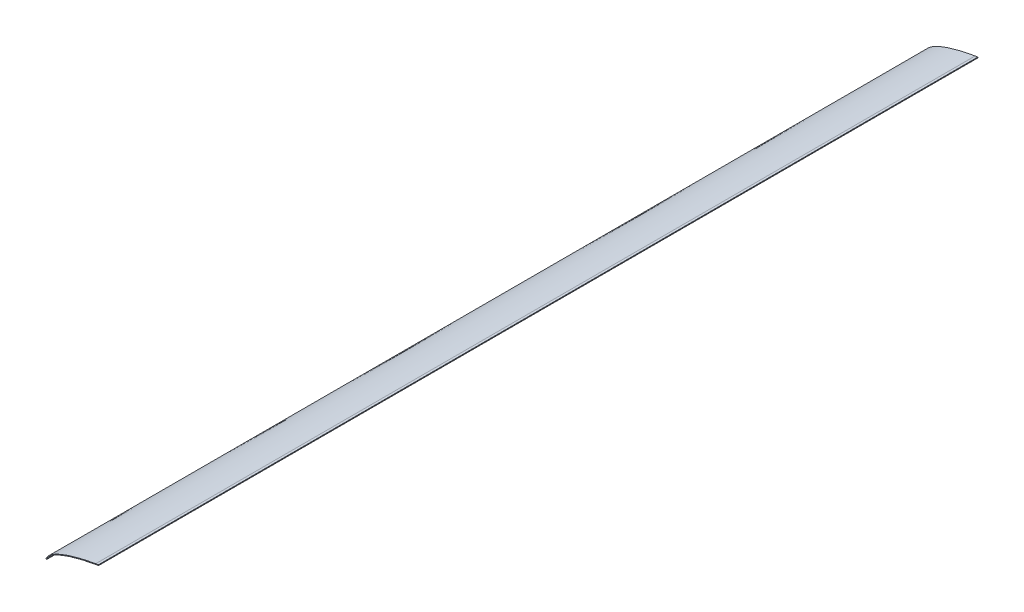
ISO-10303-21;
HEADER;
FILE_DESCRIPTION(('STEP AP214'),'2;1');
FILE_NAME('part.step','',(''),(''),'','','');
FILE_SCHEMA(('AUTOMOTIVE_DESIGN { 1 0 10303 214 1 1 1 1 }'));
ENDSEC;
DATA;
#1=APPLICATION_CONTEXT('core data for automotive mechanical design processes');
#2=APPLICATION_PROTOCOL_DEFINITION('international standard','automotive_design',2000,#1);
#3=PRODUCT_CONTEXT('',#1,'mechanical');
#4=PRODUCT('Part','Part','',(#3));
#5=PRODUCT_RELATED_PRODUCT_CATEGORY('part','',(#4));
#6=PRODUCT_DEFINITION_FORMATION('','',#4);
#7=PRODUCT_DEFINITION_CONTEXT('part definition',#1,'design');
#8=PRODUCT_DEFINITION('design','',#6,#7);
#9=PRODUCT_DEFINITION_SHAPE('','',#8);
#10=(LENGTH_UNIT() NAMED_UNIT(*) SI_UNIT(.MILLI.,.METRE.));
#11=(NAMED_UNIT(*) PLANE_ANGLE_UNIT() SI_UNIT($,.RADIAN.));
#12=(NAMED_UNIT(*) SI_UNIT($,.STERADIAN.) SOLID_ANGLE_UNIT());
#13=UNCERTAINTY_MEASURE_WITH_UNIT(LENGTH_MEASURE(1.E-05),#10,'distance_accuracy_value','');
#14=(GEOMETRIC_REPRESENTATION_CONTEXT(3) GLOBAL_UNCERTAINTY_ASSIGNED_CONTEXT((#13)) GLOBAL_UNIT_ASSIGNED_CONTEXT((#10,
#11,#12)) REPRESENTATION_CONTEXT('',''));
#15=CARTESIAN_POINT('',(0.,0.,0.));
#16=DIRECTION('',(0.,0.,1.));
#17=DIRECTION('',(1.,0.,0.));
#18=AXIS2_PLACEMENT_3D('',#15,#16,#17);
#19=CARTESIAN_POINT('',(26.1735730279579,18.1070696248927,0.));
#20=DIRECTION('',(0.,0.,1.));
#21=DIRECTION('',(1.,0.,0.));
#22=AXIS2_PLACEMENT_3D('',#19,#20,#21);
#23=PLANE('',#22);
#24=DIRECTION('',(0.986428711692198,0.164190123787241,0.));
#25=VECTOR('',#24,1.);
#26=CARTESIAN_POINT('',(60.0000000000464,25.096965283479,0.));
#27=LINE('',#26,#25);
#28=CARTESIAN_POINT('',(56.868088840388,24.5756616404486,0.));
#29=VERTEX_POINT('',#28);
#30=CARTESIAN_POINT('',(60.0000000000464,25.096965283479,0.));
#31=VERTEX_POINT('',#30);
#32=EDGE_CURVE('E92',#29,#31,#27,.T.);
#33=ORIENTED_EDGE('',*,*,#32,.T.);
#34=DIRECTION('',(0.164190123787243,-0.986428711692198,0.));
#35=VECTOR('',#34,1.);
#36=CARTESIAN_POINT('',(59.8696740892903,25.8799430733847,0.));
#37=LINE('',#36,#35);
#38=CARTESIAN_POINT('',(59.8696740892903,25.8799430733847,0.));
#39=VERTEX_POINT('',#38);
#40=EDGE_CURVE('E102',#39,#31,#37,.T.);
#41=ORIENTED_EDGE('',*,*,#40,.F.);
#42=DIRECTION('',(0.986428711692199,0.164190123787241,0.));
#43=VECTOR('',#42,1.);
#44=CARTESIAN_POINT('',(59.8696740892903,25.8799430733847,0.));
#45=LINE('',#44,#43);
#46=CARTESIAN_POINT('',(56.7377629296319,25.3586394303543,0.));
#47=VERTEX_POINT('',#46);
#48=EDGE_CURVE('E107',#47,#39,#45,.T.);
#49=ORIENTED_EDGE('',*,*,#48,.F.);
#50=CARTESIAN_POINT('',(0.266182211659313,1.84856316428566,0.));
#51=CARTESIAN_POINT('',(0.44924464314472,2.48141783019106,0.));
#52=CARTESIAN_POINT('',(0.719697200707303,3.08432936145919,0.));
#53=CARTESIAN_POINT('',(1.37239928492046,4.22504643130735,0.));
#54=CARTESIAN_POINT('',(1.75344214042597,4.76206799491569,0.));
#55=CARTESIAN_POINT('',(2.58553358979276,5.77687593522018,0.));
#56=CARTESIAN_POINT('',(3.03761658587257,6.25508580625057,0.));
#57=CARTESIAN_POINT('',(3.98470651780068,7.16260033834459,0.));
#58=CARTESIAN_POINT('',(4.47945419852874,7.5925737023852,0.));
#59=CARTESIAN_POINT('',(6.01159237537559,8.82578123051396,0.));
#60=CARTESIAN_POINT('',(7.09239267410847,9.57129417901564,0.));
#61=CARTESIAN_POINT('',(9.31483793068144,10.9599411335538,0.));
#62=CARTESIAN_POINT('',(10.4562630745476,11.6031284925342,0.));
#63=CARTESIAN_POINT('',(12.7808242306864,12.8141385533472,0.));
#64=CARTESIAN_POINT('',(13.9639436806618,13.380915492246,0.));
#65=CARTESIAN_POINT('',(16.3531244408429,14.4563366364619,0.));
#66=CARTESIAN_POINT('',(17.5604758804118,14.9654673254696,0.));
#67=CARTESIAN_POINT('',(21.2112211739816,16.4209259668176,0.));
#68=CARTESIAN_POINT('',(23.6816198400502,17.2975074083381,0.));
#69=CARTESIAN_POINT('',(28.6655262158656,18.9166318414473,0.));
#70=CARTESIAN_POINT('',(31.1788163141244,19.6589420849995,0.));
#71=CARTESIAN_POINT('',(36.2338138727653,21.0383249091718,0.));
#72=CARTESIAN_POINT('',(38.7756816859844,21.6753513203403,0.));
#73=CARTESIAN_POINT('',(43.8791516010972,22.862752341213,0.));
#74=CARTESIAN_POINT('',(46.4408972602386,23.4130209400113,0.));
#75=CARTESIAN_POINT('',(50.2944822740568,24.182908517706,0.));
#76=CARTESIAN_POINT('',(52.2240973828893,24.5538597843459,0.));
#77=CARTESIAN_POINT('',(54.1574030161472,24.9050955222655,0.));
#78=CARTESIAN_POINT('',(55.4470332570369,25.1350128545716,0.));
#79=CARTESIAN_POINT('',(56.0938750111785,25.2481256587657,0.));
#80=CARTESIAN_POINT('',(56.7377629296319,25.3586394303543,0.));
#81=B_SPLINE_CURVE_WITH_KNOTS('',3,(#50,#51,#52,#53,#54,#55,#56,#57,#58,#59,#60,#61,#62,#63,#64,
#65,#66,#67,#68,#69,#70,#71,#72,#73,#74,#75,#76,#77,#78,#79,#80),.UNSPECIFIED.,.F.,.F.,(4,2,2,2,
2,2,2,2,2,2,2,2,2,1,2,4),(0.,0.0312500000000001,0.0625000000000002,0.0937500000000002,0.125,
0.1875,0.25,0.312500000000001,0.375000000000001,0.5,0.625,0.75,0.875,0.9375,0.96875,1.),.UNSPECIFIED.);
#82=CARTESIAN_POINT('',(0.266182211659333,1.84856316428565,0.));
#83=VERTEX_POINT('',#82);
#84=EDGE_CURVE('E118',#83,#47,#81,.T.);
#85=ORIENTED_EDGE('',*,*,#84,.F.);
#86=DIRECTION('',(-0.960617945016892,0.277872567396503,0.));
#87=VECTOR('',#86,1.);
#88=CARTESIAN_POINT('',(1.02867270551649,1.62800181391468,0.));
#89=LINE('',#88,#87);
#90=CARTESIAN_POINT('',(1.02867270551649,1.62800181391468,0.));
#91=VERTEX_POINT('',#90);
#92=EDGE_CURVE('E125',#91,#83,#89,.T.);
#93=ORIENTED_EDGE('',*,*,#92,.F.);
#94=CARTESIAN_POINT('',(1.02867270551649,1.62800181391468,0.));
#95=CARTESIAN_POINT('',(1.26910284242024,2.45917959514215,0.));
#96=CARTESIAN_POINT('',(2.16801273768921,4.17333784134711,0.));
#97=CARTESIAN_POINT('',(4.24516221224329,6.4256073501974,0.));
#98=CARTESIAN_POINT('',(6.79513029223093,8.44132052099229,0.));
#99=CARTESIAN_POINT('',(10.4799443762155,10.791542168927,0.));
#100=CARTESIAN_POINT('',(15.406462343438,13.2581372528595,0.));
#101=CARTESIAN_POINT('',(21.5555350811653,15.7345861008358,0.));
#102=CARTESIAN_POINT('',(27.8492544792583,17.8591494746954,0.));
#103=CARTESIAN_POINT('',(34.2358177164054,19.7103985405859,0.));
#104=CARTESIAN_POINT('',(40.6883980359922,21.3374583404056,0.));
#105=CARTESIAN_POINT('',(48.2254204079247,23.0032324720211,0.));
#106=CARTESIAN_POINT('',(53.6330506424474,24.0204149786161,0.));
#107=CARTESIAN_POINT('',(56.868088840388,24.5756616404486,0.));
#108=B_SPLINE_CURVE_WITH_KNOTS('',3,(#94,#95,#96,#97,#98,#99,#100,#101,#102,#103,#104,#105,#106,
#107),.UNSPECIFIED.,.F.,.F.,(4,1,1,1,1,1,1,1,1,1,1,4),(0.423535425882869,0.42709852718619,
0.431188132599192,0.435277738012194,0.439367343425196,0.4475465542512,0.455725765077204,
0.463904975903208,0.472084186729212,0.480263397555217,0.488442608381221,0.500532456531814),.UNSPECIFIED.);
#109=EDGE_CURVE('E98',#91,#29,#108,.T.);
#110=ORIENTED_EDGE('',*,*,#109,.T.);
#111=EDGE_LOOP('',(#33,#41,#49,#85,#93,#110));
#112=FACE_BOUND('',#111,.T.);
#113=ADVANCED_FACE('F39',(#112),#23,.T.);
#114=CARTESIAN_POINT('',(59.8696740892903,25.8799430733847,-1064.46926122137));
#115=DIRECTION('',(-0.986428711692198,-0.164190123787243,0.));
#116=DIRECTION('',(0.164190123787243,-0.986428711692198,0.));
#117=AXIS2_PLACEMENT_3D('',#114,#115,#116);
#118=PLANE('',#117);
#119=DIRECTION('',(0.,0.,1.));
#120=VECTOR('',#119,1.);
#121=CARTESIAN_POINT('',(60.0000000000464,25.096965283479,-1064.46926122137));
#122=LINE('',#121,#120);
#123=CARTESIAN_POINT('',(60.0000000000464,25.096965283479,-1000.));
#124=VERTEX_POINT('',#123);
#125=EDGE_CURVE('E89',#124,#31,#122,.T.);
#126=ORIENTED_EDGE('',*,*,#125,.F.);
#127=DIRECTION('',(-0.164190123787243,0.986428711692198,0.));
#128=VECTOR('',#127,1.);
#129=CARTESIAN_POINT('',(59.8696740892903,25.8799430733847,-1000.));
#130=LINE('',#129,#128);
#131=CARTESIAN_POINT('',(59.8696740892903,25.8799430733847,-1000.));
#132=VERTEX_POINT('',#131);
#133=EDGE_CURVE('E43',#124,#132,#130,.T.);
#134=ORIENTED_EDGE('',*,*,#133,.T.);
#135=DIRECTION('',(0.,0.,1.));
#136=VECTOR('',#135,1.);
#137=CARTESIAN_POINT('',(59.8696740892903,25.8799430733847,-1064.46926122137));
#138=LINE('',#137,#136);
#139=EDGE_CURVE('E97',#132,#39,#138,.T.);
#140=ORIENTED_EDGE('',*,*,#139,.T.);
#141=ORIENTED_EDGE('',*,*,#40,.T.);
#142=EDGE_LOOP('',(#126,#134,#140,#141));
#143=FACE_BOUND('',#142,.T.);
#144=ADVANCED_FACE('F105',(#143),#118,.F.);
#145=CARTESIAN_POINT('',(59.8696740892903,25.8799430733847,-1064.46926122137));
#146=DIRECTION('',(0.164190123787241,-0.986428711692198,0.));
#147=DIRECTION('',(0.986428711692199,0.164190123787241,0.));
#148=AXIS2_PLACEMENT_3D('',#145,#146,#147);
#149=PLANE('',#148);
#150=ORIENTED_EDGE('',*,*,#139,.F.);
#151=DIRECTION('',(-0.986428711692199,-0.164190123787241,0.));
#152=VECTOR('',#151,1.);
#153=CARTESIAN_POINT('',(59.8696740892903,25.8799430733847,-1000.));
#154=LINE('',#153,#152);
#155=CARTESIAN_POINT('',(56.7377629296319,25.3586394303543,-1000.));
#156=VERTEX_POINT('',#155);
#157=EDGE_CURVE('E150',#132,#156,#154,.T.);
#158=ORIENTED_EDGE('',*,*,#157,.T.);
#159=DIRECTION('',(0.,0.,1.));
#160=VECTOR('',#159,1.);
#161=CARTESIAN_POINT('',(56.7377629296319,25.3586394303543,-1064.46926122137));
#162=LINE('',#161,#160);
#163=EDGE_CURVE('E145',#156,#47,#162,.T.);
#164=ORIENTED_EDGE('',*,*,#163,.T.);
#165=ORIENTED_EDGE('',*,*,#48,.T.);
#166=EDGE_LOOP('',(#150,#158,#164,#165));
#167=FACE_BOUND('',#166,.T.);
#168=ADVANCED_FACE('F147',(#167),#149,.F.);
#169=CARTESIAN_POINT('',(0.266182211659313,1.84856316428566,-1064.46926122137));
#170=CARTESIAN_POINT('',(0.44924464314472,2.48141783019106,-1064.46926122137));
#171=CARTESIAN_POINT('',(0.719697200707303,3.08432936145919,-1064.46926122137));
#172=CARTESIAN_POINT('',(1.37239928492046,4.22504643130735,-1064.46926122137));
#173=CARTESIAN_POINT('',(1.75344214042597,4.76206799491569,-1064.46926122137));
#174=CARTESIAN_POINT('',(2.58553358979276,5.77687593522018,-1064.46926122137));
#175=CARTESIAN_POINT('',(3.03761658587257,6.25508580625057,-1064.46926122137));
#176=CARTESIAN_POINT('',(3.98470651780068,7.16260033834459,-1064.46926122137));
#177=CARTESIAN_POINT('',(4.47945419852874,7.5925737023852,-1064.46926122137));
#178=CARTESIAN_POINT('',(6.01159237537559,8.82578123051396,-1064.46926122137));
#179=CARTESIAN_POINT('',(7.09239267410847,9.57129417901564,-1064.46926122137));
#180=CARTESIAN_POINT('',(9.31483793068144,10.9599411335538,-1064.46926122137));
#181=CARTESIAN_POINT('',(10.4562630745476,11.6031284925342,-1064.46926122137));
#182=CARTESIAN_POINT('',(12.7808242306864,12.8141385533472,-1064.46926122137));
#183=CARTESIAN_POINT('',(13.9639436806618,13.380915492246,-1064.46926122137));
#184=CARTESIAN_POINT('',(16.3531244408429,14.4563366364619,-1064.46926122137));
#185=CARTESIAN_POINT('',(17.5604758804118,14.9654673254696,-1064.46926122137));
#186=CARTESIAN_POINT('',(21.2112211739816,16.4209259668176,-1064.46926122137));
#187=CARTESIAN_POINT('',(23.6816198400502,17.2975074083381,-1064.46926122137));
#188=CARTESIAN_POINT('',(28.6655262158656,18.9166318414473,-1064.46926122137));
#189=CARTESIAN_POINT('',(31.1788163141244,19.6589420849995,-1064.46926122137));
#190=CARTESIAN_POINT('',(36.2338138727653,21.0383249091718,-1064.46926122137));
#191=CARTESIAN_POINT('',(38.7756816859844,21.6753513203403,-1064.46926122137));
#192=CARTESIAN_POINT('',(43.8791516010972,22.862752341213,-1064.46926122137));
#193=CARTESIAN_POINT('',(46.4408972602386,23.4130209400113,-1064.46926122137));
#194=CARTESIAN_POINT('',(50.2944822740568,24.182908517706,-1064.46926122137));
#195=CARTESIAN_POINT('',(52.2240973828893,24.5538597843459,-1064.46926122137));
#196=CARTESIAN_POINT('',(54.1574030161472,24.9050955222655,-1064.46926122137));
#197=CARTESIAN_POINT('',(55.4470332570369,25.1350128545716,-1064.46926122137));
#198=CARTESIAN_POINT('',(56.0938750111785,25.2481256587657,-1064.46926122137));
#199=CARTESIAN_POINT('',(56.7377629296319,25.3586394303543,-1064.46926122137));
#200=B_SPLINE_CURVE_WITH_KNOTS('',3,(#169,#170,#171,#172,#173,#174,#175,#176,#177,#178,#179,
#180,#181,#182,#183,#184,#185,#186,#187,#188,#189,#190,#191,#192,#193,#194,#195,#196,#197,#198,
#199),.UNSPECIFIED.,.F.,.F.,(4,2,2,2,2,2,2,2,2,2,2,2,2,1,2,4),(0.,0.0312500000000001,
0.0625000000000002,0.0937500000000002,0.125,0.1875,0.25,0.312500000000001,0.375000000000001,0.5,
0.625,0.75,0.875,0.9375,0.96875,1.),.UNSPECIFIED.);
#201=DIRECTION('',(0.,0.,1.));
#202=VECTOR('',#201,1.);
#203=SURFACE_OF_LINEAR_EXTRUSION('',#200,#202);
#204=ORIENTED_EDGE('',*,*,#163,.F.);
#205=CARTESIAN_POINT('',(0.266182211659313,1.84856316428566,-1000.));
#206=CARTESIAN_POINT('',(0.44924464314472,2.48141783019106,-1000.));
#207=CARTESIAN_POINT('',(0.719697200707303,3.08432936145919,-1000.));
#208=CARTESIAN_POINT('',(1.37239928492046,4.22504643130735,-1000.));
#209=CARTESIAN_POINT('',(1.75344214042597,4.76206799491569,-1000.));
#210=CARTESIAN_POINT('',(2.58553358979276,5.77687593522018,-1000.));
#211=CARTESIAN_POINT('',(3.03761658587257,6.25508580625057,-1000.));
#212=CARTESIAN_POINT('',(3.98470651780068,7.16260033834459,-1000.));
#213=CARTESIAN_POINT('',(4.47945419852874,7.5925737023852,-1000.));
#214=CARTESIAN_POINT('',(6.01159237537559,8.82578123051396,-1000.));
#215=CARTESIAN_POINT('',(7.09239267410847,9.57129417901564,-1000.));
#216=CARTESIAN_POINT('',(9.31483793068144,10.9599411335538,-1000.));
#217=CARTESIAN_POINT('',(10.4562630745476,11.6031284925342,-1000.));
#218=CARTESIAN_POINT('',(12.7808242306864,12.8141385533472,-1000.));
#219=CARTESIAN_POINT('',(13.9639436806618,13.380915492246,-1000.));
#220=CARTESIAN_POINT('',(16.3531244408429,14.4563366364619,-1000.));
#221=CARTESIAN_POINT('',(17.5604758804118,14.9654673254696,-1000.));
#222=CARTESIAN_POINT('',(21.2112211739816,16.4209259668176,-1000.));
#223=CARTESIAN_POINT('',(23.6816198400502,17.2975074083381,-1000.));
#224=CARTESIAN_POINT('',(28.6655262158656,18.9166318414473,-1000.));
#225=CARTESIAN_POINT('',(31.1788163141244,19.6589420849995,-1000.));
#226=CARTESIAN_POINT('',(36.2338138727653,21.0383249091718,-1000.));
#227=CARTESIAN_POINT('',(38.7756816859844,21.6753513203403,-1000.));
#228=CARTESIAN_POINT('',(43.8791516010972,22.862752341213,-1000.));
#229=CARTESIAN_POINT('',(46.4408972602386,23.4130209400113,-1000.));
#230=CARTESIAN_POINT('',(50.2944822740568,24.182908517706,-1000.));
#231=CARTESIAN_POINT('',(52.2240973828893,24.5538597843459,-1000.));
#232=CARTESIAN_POINT('',(54.1574030161472,24.9050955222655,-1000.));
#233=CARTESIAN_POINT('',(55.4470332570369,25.1350128545716,-1000.));
#234=CARTESIAN_POINT('',(56.0938750111785,25.2481256587657,-1000.));
#235=CARTESIAN_POINT('',(56.7377629296319,25.3586394303543,-1000.));
#236=B_SPLINE_CURVE_WITH_KNOTS('',3,(#205,#206,#207,#208,#209,#210,#211,#212,#213,#214,#215,
#216,#217,#218,#219,#220,#221,#222,#223,#224,#225,#226,#227,#228,#229,#230,#231,#232,#233,#234,
#235),.UNSPECIFIED.,.F.,.F.,(4,2,2,2,2,2,2,2,2,2,2,2,2,1,2,4),(0.,0.0312500000000001,
0.0625000000000002,0.0937500000000002,0.125,0.1875,0.25,0.312500000000001,0.375000000000001,0.5,
0.625,0.75,0.875,0.9375,0.96875,1.),.UNSPECIFIED.);
#237=CARTESIAN_POINT('',(0.266182211659313,1.84856316428566,-1000.));
#238=VERTEX_POINT('',#237);
#239=EDGE_CURVE('E60',#156,#238,#236,.F.);
#240=ORIENTED_EDGE('',*,*,#239,.T.);
#241=DIRECTION('',(0.,0.,1.));
#242=VECTOR('',#241,1.);
#243=CARTESIAN_POINT('',(0.266182211659333,1.84856316428565,-1064.46926122137));
#244=LINE('',#243,#242);
#245=EDGE_CURVE('E139',#238,#83,#244,.T.);
#246=ORIENTED_EDGE('',*,*,#245,.T.);
#247=ORIENTED_EDGE('',*,*,#84,.T.);
#248=EDGE_LOOP('',(#204,#240,#246,#247));
#249=FACE_BOUND('',#248,.T.);
#250=ADVANCED_FACE('F148',(#249),#203,.F.);
#251=CARTESIAN_POINT('',(1.02867270551649,1.62800181391468,-1064.46926122137));
#252=DIRECTION('',(0.277872567396503,0.960617945016892,0.));
#253=DIRECTION('',(-0.960617945016892,0.277872567396503,0.));
#254=AXIS2_PLACEMENT_3D('',#251,#252,#253);
#255=PLANE('',#254);
#256=ORIENTED_EDGE('',*,*,#245,.F.);
#257=DIRECTION('',(0.960617945016892,-0.277872567396503,0.));
#258=VECTOR('',#257,1.);
#259=CARTESIAN_POINT('',(1.02867270551649,1.62800181391468,-1000.));
#260=LINE('',#259,#258);
#261=CARTESIAN_POINT('',(1.02867270551649,1.62800181391468,-1000.));
#262=VERTEX_POINT('',#261);
#263=EDGE_CURVE('E158',#238,#262,#260,.T.);
#264=ORIENTED_EDGE('',*,*,#263,.T.);
#265=DIRECTION('',(0.,0.,1.));
#266=VECTOR('',#265,1.);
#267=CARTESIAN_POINT('',(1.02867270551649,1.62800181391468,-1064.46926122137));
#268=LINE('',#267,#266);
#269=EDGE_CURVE('E138',#262,#91,#268,.T.);
#270=ORIENTED_EDGE('',*,*,#269,.T.);
#271=ORIENTED_EDGE('',*,*,#92,.T.);
#272=EDGE_LOOP('',(#256,#264,#270,#271));
#273=FACE_BOUND('',#272,.T.);
#274=ADVANCED_FACE('F182',(#273),#255,.F.);
#275=CARTESIAN_POINT('',(1.02867270551649,1.62800181391468,-1064.46926122137));
#276=CARTESIAN_POINT('',(1.26910284242024,2.45917959514215,-1064.46926122137));
#277=CARTESIAN_POINT('',(2.16801273768921,4.17333784134711,-1064.46926122137));
#278=CARTESIAN_POINT('',(4.24516221224329,6.4256073501974,-1064.46926122137));
#279=CARTESIAN_POINT('',(6.79513029223093,8.44132052099229,-1064.46926122137));
#280=CARTESIAN_POINT('',(10.4799443762155,10.791542168927,-1064.46926122137));
#281=CARTESIAN_POINT('',(15.406462343438,13.2581372528595,-1064.46926122137));
#282=CARTESIAN_POINT('',(21.5555350811653,15.7345861008358,-1064.46926122137));
#283=CARTESIAN_POINT('',(27.8492544792583,17.8591494746954,-1064.46926122137));
#284=CARTESIAN_POINT('',(34.2358177164054,19.7103985405859,-1064.46926122137));
#285=CARTESIAN_POINT('',(40.6883980359922,21.3374583404056,-1064.46926122137));
#286=CARTESIAN_POINT('',(48.2254204079247,23.0032324720211,-1064.46926122137));
#287=CARTESIAN_POINT('',(53.6330506424474,24.0204149786161,-1064.46926122137));
#288=CARTESIAN_POINT('',(56.868088840388,24.5756616404486,-1064.46926122137));
#289=B_SPLINE_CURVE_WITH_KNOTS('',3,(#275,#276,#277,#278,#279,#280,#281,#282,#283,#284,#285,
#286,#287,#288),.UNSPECIFIED.,.F.,.F.,(4,1,1,1,1,1,1,1,1,1,1,4),(0.423535425882869,
0.42709852718619,0.431188132599192,0.435277738012194,0.439367343425196,0.4475465542512,
0.455725765077204,0.463904975903208,0.472084186729212,0.480263397555217,0.488442608381221,
0.500532456531814),.UNSPECIFIED.);
#290=DIRECTION('',(0.,0.,1.));
#291=VECTOR('',#290,1.);
#292=SURFACE_OF_LINEAR_EXTRUSION('',#289,#291);
#293=CARTESIAN_POINT('',(1.02867270551649,1.62800181391468,-1000.));
#294=CARTESIAN_POINT('',(1.26910284242024,2.45917959514215,-1000.));
#295=CARTESIAN_POINT('',(2.16801273768921,4.17333784134711,-1000.));
#296=CARTESIAN_POINT('',(4.24516221224329,6.4256073501974,-1000.));
#297=CARTESIAN_POINT('',(6.79513029223093,8.44132052099229,-1000.));
#298=CARTESIAN_POINT('',(10.4799443762155,10.791542168927,-1000.));
#299=CARTESIAN_POINT('',(15.406462343438,13.2581372528595,-1000.));
#300=CARTESIAN_POINT('',(21.5555350811653,15.7345861008358,-1000.));
#301=CARTESIAN_POINT('',(27.8492544792583,17.8591494746954,-1000.));
#302=CARTESIAN_POINT('',(34.2358177164054,19.7103985405859,-1000.));
#303=CARTESIAN_POINT('',(40.6883980359922,21.3374583404056,-1000.));
#304=CARTESIAN_POINT('',(48.2254204079247,23.0032324720211,-1000.));
#305=CARTESIAN_POINT('',(53.6330506424474,24.0204149786161,-1000.));
#306=CARTESIAN_POINT('',(56.868088840388,24.5756616404486,-1000.));
#307=B_SPLINE_CURVE_WITH_KNOTS('',3,(#293,#294,#295,#296,#297,#298,#299,#300,#301,#302,#303,
#304,#305,#306),.UNSPECIFIED.,.F.,.F.,(4,1,1,1,1,1,1,1,1,1,1,4),(0.423535425882869,
0.42709852718619,0.431188132599192,0.435277738012194,0.439367343425196,0.4475465542512,
0.455725765077204,0.463904975903208,0.472084186729212,0.480263397555217,0.488442608381221,
0.500532456531814),.UNSPECIFIED.);
#308=CARTESIAN_POINT('',(56.868088840388,24.5756616404486,-1000.));
#309=VERTEX_POINT('',#308);
#310=EDGE_CURVE('E47',#309,#262,#307,.F.);
#311=ORIENTED_EDGE('',*,*,#310,.F.);
#312=DIRECTION('',(0.,0.,1.));
#313=VECTOR('',#312,1.);
#314=CARTESIAN_POINT('',(56.868088840388,24.5756616404486,-1064.46926122137));
#315=LINE('',#314,#313);
#316=EDGE_CURVE('E133',#309,#29,#315,.T.);
#317=ORIENTED_EDGE('',*,*,#316,.T.);
#318=ORIENTED_EDGE('',*,*,#109,.F.);
#319=ORIENTED_EDGE('',*,*,#269,.F.);
#320=EDGE_LOOP('',(#311,#317,#318,#319));
#321=FACE_BOUND('',#320,.T.);
#322=ADVANCED_FACE('F157',(#321),#292,.T.);
#323=CARTESIAN_POINT('',(60.0000000000464,25.096965283479,-1064.46926122137));
#324=DIRECTION('',(0.164190123787241,-0.986428711692198,0.));
#325=DIRECTION('',(0.986428711692199,0.164190123787241,0.));
#326=AXIS2_PLACEMENT_3D('',#323,#324,#325);
#327=PLANE('',#326);
#328=DIRECTION('',(-0.986428711692199,-0.164190123787241,0.));
#329=VECTOR('',#328,1.);
#330=CARTESIAN_POINT('',(60.0000000000464,25.096965283479,-1000.));
#331=LINE('',#330,#329);
#332=EDGE_CURVE('E11',#124,#309,#331,.T.);
#333=ORIENTED_EDGE('',*,*,#332,.F.);
#334=ORIENTED_EDGE('',*,*,#125,.T.);
#335=ORIENTED_EDGE('',*,*,#32,.F.);
#336=ORIENTED_EDGE('',*,*,#316,.F.);
#337=EDGE_LOOP('',(#333,#334,#335,#336));
#338=FACE_BOUND('',#337,.T.);
#339=ADVANCED_FACE('F41',(#338),#327,.T.);
#340=CARTESIAN_POINT('',(0.406397821987738,0.00933734423304473,-1000.));
#341=DIRECTION('',(0.,0.,1.));
#342=DIRECTION('',(-0.710041561326326,0.70415976964697,0.));
#343=AXIS2_PLACEMENT_3D('',#340,#341,#342);
#344=PLANE('',#343);
#345=ORIENTED_EDGE('',*,*,#332,.T.);
#346=ORIENTED_EDGE('',*,*,#310,.T.);
#347=ORIENTED_EDGE('',*,*,#263,.F.);
#348=ORIENTED_EDGE('',*,*,#239,.F.);
#349=ORIENTED_EDGE('',*,*,#157,.F.);
#350=ORIENTED_EDGE('',*,*,#133,.F.);
#351=EDGE_LOOP('',(#345,#346,#347,#348,#349,#350));
#352=FACE_BOUND('',#351,.T.);
#353=ADVANCED_FACE('F156',(#352),#344,.F.);
#354=CLOSED_SHELL('',(#113,#144,#168,#250,#274,#322,#339,#353));
#355=MANIFOLD_SOLID_BREP('B2',#354);
#356=ADVANCED_BREP_SHAPE_REPRESENTATION('',(#18,#355),#14);
#357=SHAPE_DEFINITION_REPRESENTATION(#9,#356);
ENDSEC;
END-ISO-10303-21;
